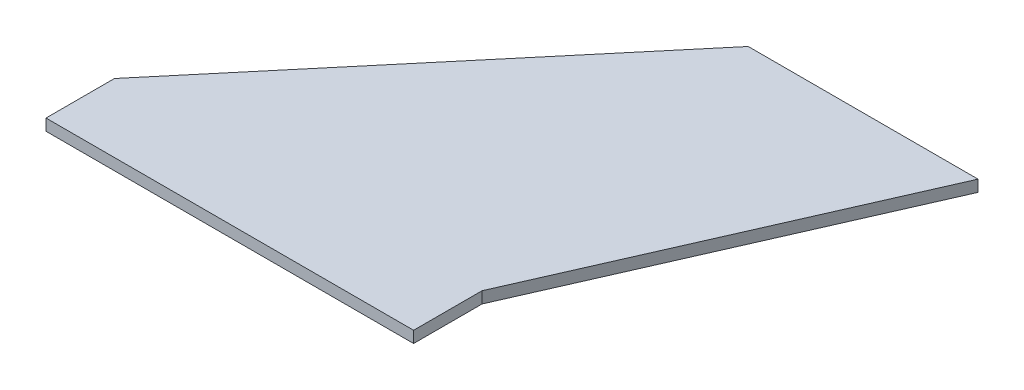
ISO-10303-21;
HEADER;
FILE_DESCRIPTION(('STEP AP214'),'2;1');
FILE_NAME('part.step','',(''),(''),'','','');
FILE_SCHEMA(('AUTOMOTIVE_DESIGN { 1 0 10303 214 1 1 1 1 }'));
ENDSEC;
DATA;
#1=APPLICATION_CONTEXT('core data for automotive mechanical design processes');
#2=APPLICATION_PROTOCOL_DEFINITION('international standard','automotive_design',2000,#1);
#3=PRODUCT_CONTEXT('',#1,'mechanical');
#4=PRODUCT('Part','Part','',(#3));
#5=PRODUCT_RELATED_PRODUCT_CATEGORY('part','',(#4));
#6=PRODUCT_DEFINITION_FORMATION('','',#4);
#7=PRODUCT_DEFINITION_CONTEXT('part definition',#1,'design');
#8=PRODUCT_DEFINITION('design','',#6,#7);
#9=PRODUCT_DEFINITION_SHAPE('','',#8);
#10=(LENGTH_UNIT() NAMED_UNIT(*) SI_UNIT(.MILLI.,.METRE.));
#11=(NAMED_UNIT(*) PLANE_ANGLE_UNIT() SI_UNIT($,.RADIAN.));
#12=(NAMED_UNIT(*) SI_UNIT($,.STERADIAN.) SOLID_ANGLE_UNIT());
#13=UNCERTAINTY_MEASURE_WITH_UNIT(LENGTH_MEASURE(1.E-05),#10,'distance_accuracy_value','');
#14=(GEOMETRIC_REPRESENTATION_CONTEXT(3) GLOBAL_UNCERTAINTY_ASSIGNED_CONTEXT((#13)) GLOBAL_UNIT_ASSIGNED_CONTEXT((#10,
#11,#12)) REPRESENTATION_CONTEXT('',''));
#15=CARTESIAN_POINT('',(0.,0.,0.));
#16=DIRECTION('',(0.,0.,1.));
#17=DIRECTION('',(1.,0.,0.));
#18=AXIS2_PLACEMENT_3D('',#15,#16,#17);
#19=CARTESIAN_POINT('',(50.8,3.175,0.));
#20=DIRECTION('',(-1.,0.,0.));
#21=DIRECTION('',(0.,0.,1.));
#22=AXIS2_PLACEMENT_3D('',#19,#20,#21);
#23=PLANE('',#22);
#24=DIRECTION('',(0.,0.,-1.));
#25=VECTOR('',#24,1.);
#26=CARTESIAN_POINT('',(50.8,0.,0.));
#27=LINE('',#26,#25);
#28=CARTESIAN_POINT('',(50.8,0.,18.923));
#29=VERTEX_POINT('',#28);
#30=CARTESIAN_POINT('',(50.8,0.,0.));
#31=VERTEX_POINT('',#30);
#32=EDGE_CURVE('E121',#29,#31,#27,.T.);
#33=ORIENTED_EDGE('',*,*,#32,.T.);
#34=DIRECTION('',(0.,-1.,0.));
#35=VECTOR('',#34,1.);
#36=CARTESIAN_POINT('',(50.8,3.175,0.));
#37=LINE('',#36,#35);
#38=CARTESIAN_POINT('',(50.8,3.175,0.));
#39=VERTEX_POINT('',#38);
#40=EDGE_CURVE('E11',#39,#31,#37,.T.);
#41=ORIENTED_EDGE('',*,*,#40,.F.);
#42=DIRECTION('',(0.,0.,-1.));
#43=VECTOR('',#42,1.);
#44=CARTESIAN_POINT('',(50.8,3.175,0.));
#45=LINE('',#44,#43);
#46=CARTESIAN_POINT('',(50.8,3.175,18.923));
#47=VERTEX_POINT('',#46);
#48=EDGE_CURVE('E131',#47,#39,#45,.T.);
#49=ORIENTED_EDGE('',*,*,#48,.F.);
#50=DIRECTION('',(0.,-1.,0.));
#51=VECTOR('',#50,1.);
#52=CARTESIAN_POINT('',(50.8,3.175,18.923));
#53=LINE('',#52,#51);
#54=EDGE_CURVE('E117',#47,#29,#53,.T.);
#55=ORIENTED_EDGE('',*,*,#54,.T.);
#56=EDGE_LOOP('',(#33,#41,#49,#55));
#57=FACE_BOUND('',#56,.T.);
#58=ADVANCED_FACE('F37',(#57),#23,.F.);
#59=CARTESIAN_POINT('',(92.6242398696362,3.175,-95.25));
#60=DIRECTION('',(-0.915618670614673,0.,-0.402047820565937));
#61=DIRECTION('',(-0.402047820565937,0.,0.915618670614673));
#62=AXIS2_PLACEMENT_3D('',#59,#60,#61);
#63=PLANE('',#62);
#64=DIRECTION('',(0.402047820565937,0.,-0.915618670614673));
#65=VECTOR('',#64,1.);
#66=CARTESIAN_POINT('',(92.6242398696362,0.,-95.25));
#67=LINE('',#66,#65);
#68=CARTESIAN_POINT('',(92.6242398696362,0.,-95.25));
#69=VERTEX_POINT('',#68);
#70=EDGE_CURVE('E124',#31,#69,#67,.T.);
#71=ORIENTED_EDGE('',*,*,#70,.T.);
#72=DIRECTION('',(0.,-1.,0.));
#73=VECTOR('',#72,1.);
#74=CARTESIAN_POINT('',(92.6242398696362,3.175,-95.25));
#75=LINE('',#74,#73);
#76=CARTESIAN_POINT('',(92.6242398696362,3.175,-95.25));
#77=VERTEX_POINT('',#76);
#78=EDGE_CURVE('E45',#77,#69,#75,.T.);
#79=ORIENTED_EDGE('',*,*,#78,.F.);
#80=DIRECTION('',(0.402047820565937,0.,-0.915618670614673));
#81=VECTOR('',#80,1.);
#82=CARTESIAN_POINT('',(92.6242398696362,3.175,-95.25));
#83=LINE('',#82,#81);
#84=EDGE_CURVE('E90',#39,#77,#83,.T.);
#85=ORIENTED_EDGE('',*,*,#84,.F.);
#86=ORIENTED_EDGE('',*,*,#40,.T.);
#87=EDGE_LOOP('',(#71,#79,#85,#86));
#88=FACE_BOUND('',#87,.T.);
#89=ADVANCED_FACE('F155',(#88),#63,.F.);
#90=CARTESIAN_POINT('',(29.1242398696362,3.175,-95.25));
#91=DIRECTION('',(0.,0.,1.));
#92=DIRECTION('',(1.,0.,0.));
#93=AXIS2_PLACEMENT_3D('',#90,#91,#92);
#94=PLANE('',#93);
#95=DIRECTION('',(-1.,0.,0.));
#96=VECTOR('',#95,1.);
#97=CARTESIAN_POINT('',(29.1242398696362,0.,-95.25));
#98=LINE('',#97,#96);
#99=CARTESIAN_POINT('',(29.1242398696362,0.,-95.25));
#100=VERTEX_POINT('',#99);
#101=EDGE_CURVE('E126',#69,#100,#98,.T.);
#102=ORIENTED_EDGE('',*,*,#101,.T.);
#103=DIRECTION('',(0.,-1.,0.));
#104=VECTOR('',#103,1.);
#105=CARTESIAN_POINT('',(29.1242398696362,3.175,-95.25));
#106=LINE('',#105,#104);
#107=CARTESIAN_POINT('',(29.1242398696362,3.175,-95.25));
#108=VERTEX_POINT('',#107);
#109=EDGE_CURVE('E112',#108,#100,#106,.T.);
#110=ORIENTED_EDGE('',*,*,#109,.F.);
#111=DIRECTION('',(-1.,0.,0.));
#112=VECTOR('',#111,1.);
#113=CARTESIAN_POINT('',(29.1242398696362,3.175,-95.25));
#114=LINE('',#113,#112);
#115=EDGE_CURVE('E103',#77,#108,#114,.T.);
#116=ORIENTED_EDGE('',*,*,#115,.F.);
#117=ORIENTED_EDGE('',*,*,#78,.T.);
#118=EDGE_LOOP('',(#102,#110,#116,#117));
#119=FACE_BOUND('',#118,.T.);
#120=ADVANCED_FACE('F137',(#119),#94,.F.);
#121=CARTESIAN_POINT('',(-50.8,3.175,0.));
#122=DIRECTION('',(0.766044443118977,0.,0.64278760968654));
#123=DIRECTION('',(0.642787609686541,0.,-0.766044443118977));
#124=AXIS2_PLACEMENT_3D('',#121,#122,#123);
#125=PLANE('',#124);
#126=DIRECTION('',(-0.642787609686541,0.,0.766044443118977));
#127=VECTOR('',#126,1.);
#128=CARTESIAN_POINT('',(-50.8,0.,0.));
#129=LINE('',#128,#127);
#130=CARTESIAN_POINT('',(-50.8,0.,0.));
#131=VERTEX_POINT('',#130);
#132=EDGE_CURVE('E111',#100,#131,#129,.T.);
#133=ORIENTED_EDGE('',*,*,#132,.T.);
#134=DIRECTION('',(0.,-1.,0.));
#135=VECTOR('',#134,1.);
#136=CARTESIAN_POINT('',(-50.8,3.175,0.));
#137=LINE('',#136,#135);
#138=CARTESIAN_POINT('',(-50.8,3.175,0.));
#139=VERTEX_POINT('',#138);
#140=EDGE_CURVE('E108',#139,#131,#137,.T.);
#141=ORIENTED_EDGE('',*,*,#140,.F.);
#142=DIRECTION('',(-0.642787609686541,0.,0.766044443118977));
#143=VECTOR('',#142,1.);
#144=CARTESIAN_POINT('',(-50.8,3.175,0.));
#145=LINE('',#144,#143);
#146=EDGE_CURVE('E97',#108,#139,#145,.T.);
#147=ORIENTED_EDGE('',*,*,#146,.F.);
#148=ORIENTED_EDGE('',*,*,#109,.T.);
#149=EDGE_LOOP('',(#133,#141,#147,#148));
#150=FACE_BOUND('',#149,.T.);
#151=ADVANCED_FACE('F109',(#150),#125,.F.);
#152=CARTESIAN_POINT('',(-50.8,3.175,18.923));
#153=DIRECTION('',(1.,0.,0.));
#154=DIRECTION('',(0.,0.,-1.));
#155=AXIS2_PLACEMENT_3D('',#152,#153,#154);
#156=PLANE('',#155);
#157=DIRECTION('',(0.,0.,1.));
#158=VECTOR('',#157,1.);
#159=CARTESIAN_POINT('',(-50.8,0.,18.923));
#160=LINE('',#159,#158);
#161=CARTESIAN_POINT('',(-50.8,0.,18.923));
#162=VERTEX_POINT('',#161);
#163=EDGE_CURVE('E76',#131,#162,#160,.T.);
#164=ORIENTED_EDGE('',*,*,#163,.T.);
#165=DIRECTION('',(0.,-1.,0.));
#166=VECTOR('',#165,1.);
#167=CARTESIAN_POINT('',(-50.8,3.175,18.923));
#168=LINE('',#167,#166);
#169=CARTESIAN_POINT('',(-50.8,3.175,18.923));
#170=VERTEX_POINT('',#169);
#171=EDGE_CURVE('E113',#170,#162,#168,.T.);
#172=ORIENTED_EDGE('',*,*,#171,.F.);
#173=DIRECTION('',(0.,0.,1.));
#174=VECTOR('',#173,1.);
#175=CARTESIAN_POINT('',(-50.8,3.175,18.923));
#176=LINE('',#175,#174);
#177=EDGE_CURVE('E101',#139,#170,#176,.T.);
#178=ORIENTED_EDGE('',*,*,#177,.F.);
#179=ORIENTED_EDGE('',*,*,#140,.T.);
#180=EDGE_LOOP('',(#164,#172,#178,#179));
#181=FACE_BOUND('',#180,.T.);
#182=ADVANCED_FACE('F115',(#181),#156,.F.);
#183=CARTESIAN_POINT('',(50.8,3.175,18.923));
#184=DIRECTION('',(0.,0.,-1.));
#185=DIRECTION('',(-1.,0.,0.));
#186=AXIS2_PLACEMENT_3D('',#183,#184,#185);
#187=PLANE('',#186);
#188=DIRECTION('',(1.,0.,0.));
#189=VECTOR('',#188,1.);
#190=CARTESIAN_POINT('',(50.8,0.,18.923));
#191=LINE('',#190,#189);
#192=EDGE_CURVE('E82',#162,#29,#191,.T.);
#193=ORIENTED_EDGE('',*,*,#192,.T.);
#194=ORIENTED_EDGE('',*,*,#54,.F.);
#195=DIRECTION('',(1.,0.,0.));
#196=VECTOR('',#195,1.);
#197=CARTESIAN_POINT('',(50.8,3.175,18.923));
#198=LINE('',#197,#196);
#199=EDGE_CURVE('E53',#170,#47,#198,.T.);
#200=ORIENTED_EDGE('',*,*,#199,.F.);
#201=ORIENTED_EDGE('',*,*,#171,.T.);
#202=EDGE_LOOP('',(#193,#194,#200,#201));
#203=FACE_BOUND('',#202,.T.);
#204=ADVANCED_FACE('F144',(#203),#187,.F.);
#205=CARTESIAN_POINT('',(0.,3.175,0.));
#206=DIRECTION('',(0.,-1.,0.));
#207=DIRECTION('',(0.,0.,-1.));
#208=AXIS2_PLACEMENT_3D('',#205,#206,#207);
#209=PLANE('',#208);
#210=ORIENTED_EDGE('',*,*,#48,.T.);
#211=ORIENTED_EDGE('',*,*,#84,.T.);
#212=ORIENTED_EDGE('',*,*,#115,.T.);
#213=ORIENTED_EDGE('',*,*,#146,.T.);
#214=ORIENTED_EDGE('',*,*,#177,.T.);
#215=ORIENTED_EDGE('',*,*,#199,.T.);
#216=EDGE_LOOP('',(#210,#211,#212,#213,#214,#215));
#217=FACE_BOUND('',#216,.T.);
#218=ADVANCED_FACE('F99',(#217),#209,.F.);
#219=CARTESIAN_POINT('',(0.,0.,0.));
#220=DIRECTION('',(0.,-1.,0.));
#221=DIRECTION('',(0.,0.,-1.));
#222=AXIS2_PLACEMENT_3D('',#219,#220,#221);
#223=PLANE('',#222);
#224=ORIENTED_EDGE('',*,*,#32,.F.);
#225=ORIENTED_EDGE('',*,*,#192,.F.);
#226=ORIENTED_EDGE('',*,*,#163,.F.);
#227=ORIENTED_EDGE('',*,*,#132,.F.);
#228=ORIENTED_EDGE('',*,*,#101,.F.);
#229=ORIENTED_EDGE('',*,*,#70,.F.);
#230=EDGE_LOOP('',(#224,#225,#226,#227,#228,#229));
#231=FACE_BOUND('',#230,.T.);
#232=ADVANCED_FACE('F140',(#231),#223,.T.);
#233=CLOSED_SHELL('',(#58,#89,#120,#151,#182,#204,#218,#232));
#234=MANIFOLD_SOLID_BREP('B2',#233);
#235=ADVANCED_BREP_SHAPE_REPRESENTATION('',(#18,#234),#14);
#236=SHAPE_DEFINITION_REPRESENTATION(#9,#235);
ENDSEC;
END-ISO-10303-21;
